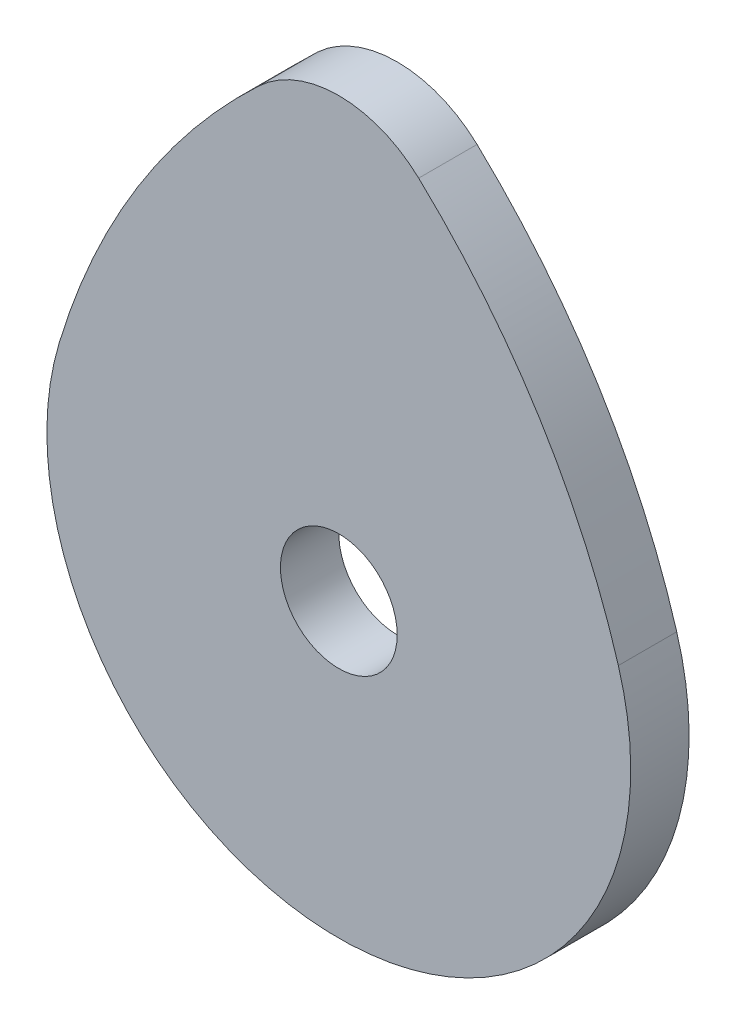
ISO-10303-21;
HEADER;
FILE_DESCRIPTION(('STEP AP214'),'2;1');
FILE_NAME('part.step','',(''),(''),'','','');
FILE_SCHEMA(('AUTOMOTIVE_DESIGN { 1 0 10303 214 1 1 1 1 }'));
ENDSEC;
DATA;
#1=APPLICATION_CONTEXT('core data for automotive mechanical design processes');
#2=APPLICATION_PROTOCOL_DEFINITION('international standard','automotive_design',2000,#1);
#3=PRODUCT_CONTEXT('',#1,'mechanical');
#4=PRODUCT('Part','Part','',(#3));
#5=PRODUCT_RELATED_PRODUCT_CATEGORY('part','',(#4));
#6=PRODUCT_DEFINITION_FORMATION('','',#4);
#7=PRODUCT_DEFINITION_CONTEXT('part definition',#1,'design');
#8=PRODUCT_DEFINITION('design','',#6,#7);
#9=PRODUCT_DEFINITION_SHAPE('','',#8);
#10=(LENGTH_UNIT() NAMED_UNIT(*) SI_UNIT(.MILLI.,.METRE.));
#11=(NAMED_UNIT(*) PLANE_ANGLE_UNIT() SI_UNIT($,.RADIAN.));
#12=(NAMED_UNIT(*) SI_UNIT($,.STERADIAN.) SOLID_ANGLE_UNIT());
#13=UNCERTAINTY_MEASURE_WITH_UNIT(LENGTH_MEASURE(1.E-05),#10,'distance_accuracy_value','');
#14=(GEOMETRIC_REPRESENTATION_CONTEXT(3) GLOBAL_UNCERTAINTY_ASSIGNED_CONTEXT((#13)) GLOBAL_UNIT_ASSIGNED_CONTEXT((#10,
#11,#12)) REPRESENTATION_CONTEXT('',''));
#15=CARTESIAN_POINT('',(0.,0.,0.));
#16=DIRECTION('',(0.,0.,1.));
#17=DIRECTION('',(1.,0.,0.));
#18=AXIS2_PLACEMENT_3D('',#15,#16,#17);
#19=CARTESIAN_POINT('',(182.435535710789,-54.8409090909091,50.8));
#20=DIRECTION('',(0.,0.,1.));
#21=DIRECTION('',(1.,0.,0.));
#22=AXIS2_PLACEMENT_3D('',#19,#20,#21);
#23=PLANE('',#22);
#24=CARTESIAN_POINT('',(364.871071421579,-109.681818181818,50.8));
#25=DIRECTION('',(0.,0.,1.));
#26=DIRECTION('',(1.,0.,0.));
#27=AXIS2_PLACEMENT_3D('',#24,#25,#26);
#28=CIRCLE('',#27,635.);
#29=CARTESIAN_POINT('',(-69.4992516993483,353.510822510822,50.8));
#30=VERTEX_POINT('',#29);
#31=CARTESIAN_POINT('',(-243.247380947719,73.1212121212122,50.8));
#32=VERTEX_POINT('',#31);
#33=EDGE_CURVE('E85',#30,#32,#28,.T.);
#34=ORIENTED_EDGE('',*,*,#33,.T.);
#35=CARTESIAN_POINT('',(0.,0.,50.8));
#36=DIRECTION('',(0.,0.,1.));
#37=DIRECTION('',(1.,0.,0.));
#38=AXIS2_PLACEMENT_3D('',#35,#36,#37);
#39=CIRCLE('',#38,254.);
#40=CARTESIAN_POINT('',(243.247380947719,73.121212121212,50.8));
#41=VERTEX_POINT('',#40);
#42=EDGE_CURVE('E80',#32,#41,#39,.T.);
#43=ORIENTED_EDGE('',*,*,#42,.T.);
#44=CARTESIAN_POINT('',(-364.871071421579,-109.681818181818,50.8));
#45=DIRECTION('',(0.,0.,1.));
#46=DIRECTION('',(-1.,0.,0.));
#47=AXIS2_PLACEMENT_3D('',#44,#45,#46);
#48=CIRCLE('',#47,635.);
#49=CARTESIAN_POINT('',(69.4992516993483,353.510822510822,50.8));
#50=VERTEX_POINT('',#49);
#51=EDGE_CURVE('E83',#41,#50,#48,.T.);
#52=ORIENTED_EDGE('',*,*,#51,.T.);
#53=CARTESIAN_POINT('',(0.,279.4,50.8));
#54=DIRECTION('',(0.,0.,1.));
#55=DIRECTION('',(1.,0.,0.));
#56=AXIS2_PLACEMENT_3D('',#53,#54,#55);
#57=CIRCLE('',#56,101.6);
#58=EDGE_CURVE('E50',#50,#30,#57,.T.);
#59=ORIENTED_EDGE('',*,*,#58,.T.);
#60=EDGE_LOOP('',(#34,#43,#52,#59));
#61=FACE_BOUND('',#60,.T.);
#62=CARTESIAN_POINT('',(0.,0.,50.8));
#63=DIRECTION('',(0.,0.,1.));
#64=DIRECTION('',(1.,0.,0.));
#65=AXIS2_PLACEMENT_3D('',#62,#63,#64);
#66=CIRCLE('',#65,50.8);
#67=CARTESIAN_POINT('',(50.8,0.,50.8));
#68=VERTEX_POINT('',#67);
#69=EDGE_CURVE('E100',#68,#68,#66,.T.);
#70=ORIENTED_EDGE('',*,*,#69,.F.);
#71=EDGE_LOOP('',(#70));
#72=FACE_BOUND('',#71,.T.);
#73=ADVANCED_FACE('F33',(#61,#72),#23,.T.);
#74=CARTESIAN_POINT('',(182.435535710789,-54.8409090909091,0.));
#75=DIRECTION('',(0.,0.,1.));
#76=DIRECTION('',(1.,0.,0.));
#77=AXIS2_PLACEMENT_3D('',#74,#75,#76);
#78=PLANE('',#77);
#79=CARTESIAN_POINT('',(364.871071421579,-109.681818181818,0.));
#80=DIRECTION('',(0.,0.,1.));
#81=DIRECTION('',(1.,0.,0.));
#82=AXIS2_PLACEMENT_3D('',#79,#80,#81);
#83=CIRCLE('',#82,635.);
#84=CARTESIAN_POINT('',(-69.4992516993483,353.510822510822,0.));
#85=VERTEX_POINT('',#84);
#86=CARTESIAN_POINT('',(-243.247380947719,73.1212121212122,0.));
#87=VERTEX_POINT('',#86);
#88=EDGE_CURVE('E97',#85,#87,#83,.T.);
#89=ORIENTED_EDGE('',*,*,#88,.F.);
#90=CARTESIAN_POINT('',(0.,279.4,0.));
#91=DIRECTION('',(0.,0.,1.));
#92=DIRECTION('',(1.,0.,0.));
#93=AXIS2_PLACEMENT_3D('',#90,#91,#92);
#94=CIRCLE('',#93,101.6);
#95=CARTESIAN_POINT('',(69.4992516993483,353.510822510822,0.));
#96=VERTEX_POINT('',#95);
#97=EDGE_CURVE('E73',#96,#85,#94,.T.);
#98=ORIENTED_EDGE('',*,*,#97,.F.);
#99=CARTESIAN_POINT('',(-364.871071421579,-109.681818181818,0.));
#100=DIRECTION('',(0.,0.,1.));
#101=DIRECTION('',(-1.,0.,0.));
#102=AXIS2_PLACEMENT_3D('',#99,#100,#101);
#103=CIRCLE('',#102,635.);
#104=CARTESIAN_POINT('',(243.247380947719,73.121212121212,0.));
#105=VERTEX_POINT('',#104);
#106=EDGE_CURVE('E67',#105,#96,#103,.T.);
#107=ORIENTED_EDGE('',*,*,#106,.F.);
#108=CARTESIAN_POINT('',(0.,0.,0.));
#109=DIRECTION('',(0.,0.,1.));
#110=DIRECTION('',(1.,0.,0.));
#111=AXIS2_PLACEMENT_3D('',#108,#109,#110);
#112=CIRCLE('',#111,254.);
#113=EDGE_CURVE('E89',#87,#105,#112,.T.);
#114=ORIENTED_EDGE('',*,*,#113,.F.);
#115=EDGE_LOOP('',(#89,#98,#107,#114));
#116=FACE_BOUND('',#115,.T.);
#117=CARTESIAN_POINT('',(0.,0.,0.));
#118=DIRECTION('',(0.,0.,1.));
#119=DIRECTION('',(1.,0.,0.));
#120=AXIS2_PLACEMENT_3D('',#117,#118,#119);
#121=CIRCLE('',#120,50.8);
#122=CARTESIAN_POINT('',(50.8,0.,0.));
#123=VERTEX_POINT('',#122);
#124=EDGE_CURVE('E112',#123,#123,#121,.T.);
#125=ORIENTED_EDGE('',*,*,#124,.T.);
#126=EDGE_LOOP('',(#125));
#127=FACE_BOUND('',#126,.T.);
#128=ADVANCED_FACE('F108',(#116,#127),#78,.F.);
#129=CARTESIAN_POINT('',(364.871071421579,-109.681818181818,50.8));
#130=DIRECTION('',(0.,0.,-1.));
#131=DIRECTION('',(-1.,0.,0.));
#132=AXIS2_PLACEMENT_3D('',#129,#130,#131);
#133=CYLINDRICAL_SURFACE('',#132,635.);
#134=ORIENTED_EDGE('',*,*,#88,.T.);
#135=DIRECTION('',(0.,0.,-1.));
#136=VECTOR('',#135,1.);
#137=CARTESIAN_POINT('',(-243.247380947719,73.1212121212122,50.8));
#138=LINE('',#137,#136);
#139=EDGE_CURVE('E11',#32,#87,#138,.T.);
#140=ORIENTED_EDGE('',*,*,#139,.F.);
#141=ORIENTED_EDGE('',*,*,#33,.F.);
#142=DIRECTION('',(0.,0.,-1.));
#143=VECTOR('',#142,1.);
#144=CARTESIAN_POINT('',(-69.4992516993483,353.510822510822,50.8));
#145=LINE('',#144,#143);
#146=EDGE_CURVE('E93',#30,#85,#145,.T.);
#147=ORIENTED_EDGE('',*,*,#146,.T.);
#148=EDGE_LOOP('',(#134,#140,#141,#147));
#149=FACE_BOUND('',#148,.T.);
#150=ADVANCED_FACE('F35',(#149),#133,.T.);
#151=CARTESIAN_POINT('',(0.,0.,50.8));
#152=DIRECTION('',(0.,0.,-1.));
#153=DIRECTION('',(-1.,0.,0.));
#154=AXIS2_PLACEMENT_3D('',#151,#152,#153);
#155=CYLINDRICAL_SURFACE('',#154,254.);
#156=ORIENTED_EDGE('',*,*,#113,.T.);
#157=DIRECTION('',(0.,0.,-1.));
#158=VECTOR('',#157,1.);
#159=CARTESIAN_POINT('',(243.247380947719,73.121212121212,50.8));
#160=LINE('',#159,#158);
#161=EDGE_CURVE('E42',#41,#105,#160,.T.);
#162=ORIENTED_EDGE('',*,*,#161,.F.);
#163=ORIENTED_EDGE('',*,*,#42,.F.);
#164=ORIENTED_EDGE('',*,*,#139,.T.);
#165=EDGE_LOOP('',(#156,#162,#163,#164));
#166=FACE_BOUND('',#165,.T.);
#167=ADVANCED_FACE('F88',(#166),#155,.T.);
#168=CARTESIAN_POINT('',(-364.871071421579,-109.681818181818,50.8));
#169=DIRECTION('',(0.,0.,-1.));
#170=DIRECTION('',(-1.,0.,0.));
#171=AXIS2_PLACEMENT_3D('',#168,#169,#170);
#172=CYLINDRICAL_SURFACE('',#171,635.);
#173=ORIENTED_EDGE('',*,*,#106,.T.);
#174=DIRECTION('',(0.,0.,-1.));
#175=VECTOR('',#174,1.);
#176=CARTESIAN_POINT('',(69.4992516993483,353.510822510822,50.8));
#177=LINE('',#176,#175);
#178=EDGE_CURVE('E90',#50,#96,#177,.T.);
#179=ORIENTED_EDGE('',*,*,#178,.F.);
#180=ORIENTED_EDGE('',*,*,#51,.F.);
#181=ORIENTED_EDGE('',*,*,#161,.T.);
#182=EDGE_LOOP('',(#173,#179,#180,#181));
#183=FACE_BOUND('',#182,.T.);
#184=ADVANCED_FACE('F91',(#183),#172,.T.);
#185=CARTESIAN_POINT('',(0.,279.4,50.8));
#186=DIRECTION('',(0.,0.,-1.));
#187=DIRECTION('',(-1.,0.,0.));
#188=AXIS2_PLACEMENT_3D('',#185,#186,#187);
#189=CYLINDRICAL_SURFACE('',#188,101.6);
#190=ORIENTED_EDGE('',*,*,#97,.T.);
#191=ORIENTED_EDGE('',*,*,#146,.F.);
#192=ORIENTED_EDGE('',*,*,#58,.F.);
#193=ORIENTED_EDGE('',*,*,#178,.T.);
#194=EDGE_LOOP('',(#190,#191,#192,#193));
#195=FACE_BOUND('',#194,.T.);
#196=ADVANCED_FACE('F105',(#195),#189,.T.);
#197=CARTESIAN_POINT('',(0.,0.,50.8));
#198=DIRECTION('',(0.,0.,-1.));
#199=DIRECTION('',(-1.,0.,0.));
#200=AXIS2_PLACEMENT_3D('',#197,#198,#199);
#201=CYLINDRICAL_SURFACE('',#200,50.8);
#202=ORIENTED_EDGE('',*,*,#69,.T.);
#203=EDGE_LOOP('',(#202));
#204=FACE_BOUND('',#203,.T.);
#205=ORIENTED_EDGE('',*,*,#124,.F.);
#206=EDGE_LOOP('',(#205));
#207=FACE_BOUND('',#206,.T.);
#208=ADVANCED_FACE('F118',(#204,#207),#201,.F.);
#209=CLOSED_SHELL('',(#73,#128,#150,#167,#184,#196,#208));
#210=MANIFOLD_SOLID_BREP('B2',#209);
#211=ADVANCED_BREP_SHAPE_REPRESENTATION('',(#18,#210),#14);
#212=SHAPE_DEFINITION_REPRESENTATION(#9,#211);
ENDSEC;
END-ISO-10303-21;
